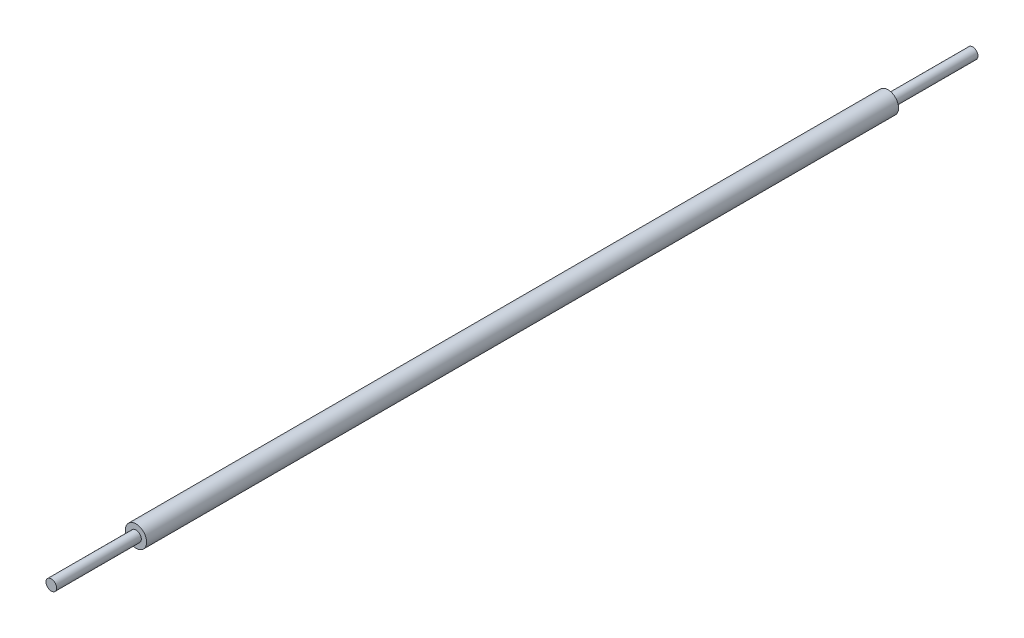
ISO-10303-21;
HEADER;
FILE_DESCRIPTION(('STEP AP214'),'2;1');
FILE_NAME('part.step','',(''),(''),'','','');
FILE_SCHEMA(('AUTOMOTIVE_DESIGN { 1 0 10303 214 1 1 1 1 }'));
ENDSEC;
DATA;
#1=APPLICATION_CONTEXT('core data for automotive mechanical design processes');
#2=APPLICATION_PROTOCOL_DEFINITION('international standard','automotive_design',2000,#1);
#3=PRODUCT_CONTEXT('',#1,'mechanical');
#4=PRODUCT('Part','Part','',(#3));
#5=PRODUCT_RELATED_PRODUCT_CATEGORY('part','',(#4));
#6=PRODUCT_DEFINITION_FORMATION('','',#4);
#7=PRODUCT_DEFINITION_CONTEXT('part definition',#1,'design');
#8=PRODUCT_DEFINITION('design','',#6,#7);
#9=PRODUCT_DEFINITION_SHAPE('','',#8);
#10=(LENGTH_UNIT() NAMED_UNIT(*) SI_UNIT(.MILLI.,.METRE.));
#11=(NAMED_UNIT(*) PLANE_ANGLE_UNIT() SI_UNIT($,.RADIAN.));
#12=(NAMED_UNIT(*) SI_UNIT($,.STERADIAN.) SOLID_ANGLE_UNIT());
#13=UNCERTAINTY_MEASURE_WITH_UNIT(LENGTH_MEASURE(1.E-05),#10,'distance_accuracy_value','');
#14=(GEOMETRIC_REPRESENTATION_CONTEXT(3) GLOBAL_UNCERTAINTY_ASSIGNED_CONTEXT((#13)) GLOBAL_UNIT_ASSIGNED_CONTEXT((#10,
#11,#12)) REPRESENTATION_CONTEXT('',''));
#15=CARTESIAN_POINT('',(0.,0.,0.));
#16=DIRECTION('',(0.,0.,1.));
#17=DIRECTION('',(1.,0.,0.));
#18=AXIS2_PLACEMENT_3D('',#15,#16,#17);
#19=CARTESIAN_POINT('',(0.,0.,177.5));
#20=DIRECTION('',(0.,0.,-1.));
#21=DIRECTION('',(-1.,0.,0.));
#22=AXIS2_PLACEMENT_3D('',#19,#20,#21);
#23=CYLINDRICAL_SURFACE('',#22,2.5);
#24=CARTESIAN_POINT('',(0.,0.,177.5));
#25=DIRECTION('',(0.,0.,1.));
#26=DIRECTION('',(1.,0.,0.));
#27=AXIS2_PLACEMENT_3D('',#24,#25,#26);
#28=CIRCLE('',#27,2.5);
#29=CARTESIAN_POINT('',(2.5,0.,177.5));
#30=VERTEX_POINT('',#29);
#31=EDGE_CURVE('E39',#30,#30,#28,.T.);
#32=ORIENTED_EDGE('',*,*,#31,.F.);
#33=EDGE_LOOP('',(#32));
#34=FACE_BOUND('',#33,.T.);
#35=CARTESIAN_POINT('',(0.,0.,0.));
#36=DIRECTION('',(0.,0.,1.));
#37=DIRECTION('',(1.,0.,0.));
#38=AXIS2_PLACEMENT_3D('',#35,#36,#37);
#39=CIRCLE('',#38,2.5);
#40=CARTESIAN_POINT('',(2.5,0.,0.));
#41=VERTEX_POINT('',#40);
#42=EDGE_CURVE('E43',#41,#41,#39,.T.);
#43=ORIENTED_EDGE('',*,*,#42,.T.);
#44=EDGE_LOOP('',(#43));
#45=FACE_BOUND('',#44,.T.);
#46=ADVANCED_FACE('F33',(#34,#45),#23,.T.);
#47=CARTESIAN_POINT('',(0.,0.,177.5));
#48=DIRECTION('',(0.,0.,1.));
#49=DIRECTION('',(1.,0.,0.));
#50=AXIS2_PLACEMENT_3D('',#47,#48,#49);
#51=PLANE('',#50);
#52=CARTESIAN_POINT('',(0.,0.,177.5));
#53=DIRECTION('',(0.,0.,1.));
#54=DIRECTION('',(1.,0.,0.));
#55=AXIS2_PLACEMENT_3D('',#52,#53,#54);
#56=CIRCLE('',#55,1.25);
#57=CARTESIAN_POINT('',(1.25,0.,177.5));
#58=VERTEX_POINT('',#57);
#59=EDGE_CURVE('E50',#58,#58,#56,.T.);
#60=ORIENTED_EDGE('',*,*,#59,.F.);
#61=EDGE_LOOP('',(#60));
#62=FACE_BOUND('',#61,.T.);
#63=ORIENTED_EDGE('',*,*,#31,.T.);
#64=EDGE_LOOP('',(#63));
#65=FACE_BOUND('',#64,.T.);
#66=ADVANCED_FACE('F74',(#62,#65),#51,.T.);
#67=CARTESIAN_POINT('',(0.,0.,0.));
#68=DIRECTION('',(0.,0.,1.));
#69=DIRECTION('',(1.,0.,0.));
#70=AXIS2_PLACEMENT_3D('',#67,#68,#69);
#71=PLANE('',#70);
#72=CARTESIAN_POINT('',(0.,0.,0.));
#73=DIRECTION('',(0.,0.,1.));
#74=DIRECTION('',(1.,0.,0.));
#75=AXIS2_PLACEMENT_3D('',#72,#73,#74);
#76=CIRCLE('',#75,1.25);
#77=CARTESIAN_POINT('',(1.25,0.,0.));
#78=VERTEX_POINT('',#77);
#79=EDGE_CURVE('E10',#78,#78,#76,.F.);
#80=ORIENTED_EDGE('',*,*,#79,.F.);
#81=EDGE_LOOP('',(#80));
#82=FACE_BOUND('',#81,.T.);
#83=ORIENTED_EDGE('',*,*,#42,.F.);
#84=EDGE_LOOP('',(#83));
#85=FACE_BOUND('',#84,.T.);
#86=ADVANCED_FACE('F79',(#82,#85),#71,.F.);
#87=CARTESIAN_POINT('',(0.,0.,197.5));
#88=DIRECTION('',(0.,0.,-1.));
#89=DIRECTION('',(-1.,0.,0.));
#90=AXIS2_PLACEMENT_3D('',#87,#88,#89);
#91=CYLINDRICAL_SURFACE('',#90,1.25);
#92=CARTESIAN_POINT('',(0.,0.,197.5));
#93=DIRECTION('',(0.,0.,1.));
#94=DIRECTION('',(1.,0.,0.));
#95=AXIS2_PLACEMENT_3D('',#92,#93,#94);
#96=CIRCLE('',#95,1.25);
#97=CARTESIAN_POINT('',(1.25,0.,197.5));
#98=VERTEX_POINT('',#97);
#99=EDGE_CURVE('E48',#98,#98,#96,.T.);
#100=ORIENTED_EDGE('',*,*,#99,.F.);
#101=EDGE_LOOP('',(#100));
#102=FACE_BOUND('',#101,.T.);
#103=ORIENTED_EDGE('',*,*,#59,.T.);
#104=EDGE_LOOP('',(#103));
#105=FACE_BOUND('',#104,.T.);
#106=ADVANCED_FACE('F70',(#102,#105),#91,.T.);
#107=CARTESIAN_POINT('',(0.,0.,197.5));
#108=DIRECTION('',(0.,0.,1.));
#109=DIRECTION('',(1.,0.,0.));
#110=AXIS2_PLACEMENT_3D('',#107,#108,#109);
#111=PLANE('',#110);
#112=ORIENTED_EDGE('',*,*,#99,.T.);
#113=EDGE_LOOP('',(#112));
#114=FACE_BOUND('',#113,.T.);
#115=ADVANCED_FACE('F63',(#114),#111,.T.);
#116=CARTESIAN_POINT('',(0.,0.,-20.));
#117=DIRECTION('',(0.,0.,1.));
#118=DIRECTION('',(1.,0.,0.));
#119=AXIS2_PLACEMENT_3D('',#116,#117,#118);
#120=CYLINDRICAL_SURFACE('',#119,1.25);
#121=CARTESIAN_POINT('',(0.,0.,-20.));
#122=DIRECTION('',(0.,0.,-1.));
#123=DIRECTION('',(-1.,0.,0.));
#124=AXIS2_PLACEMENT_3D('',#121,#122,#123);
#125=CIRCLE('',#124,1.25);
#126=CARTESIAN_POINT('',(-1.25,0.,-20.));
#127=VERTEX_POINT('',#126);
#128=EDGE_CURVE('E53',#127,#127,#125,.T.);
#129=ORIENTED_EDGE('',*,*,#128,.F.);
#130=EDGE_LOOP('',(#129));
#131=FACE_BOUND('',#130,.T.);
#132=ORIENTED_EDGE('',*,*,#79,.T.);
#133=EDGE_LOOP('',(#132));
#134=FACE_BOUND('',#133,.T.);
#135=ADVANCED_FACE('F61',(#131,#134),#120,.T.);
#136=CARTESIAN_POINT('',(0.,0.,-20.));
#137=DIRECTION('',(0.,0.,-1.));
#138=DIRECTION('',(-1.,0.,0.));
#139=AXIS2_PLACEMENT_3D('',#136,#137,#138);
#140=PLANE('',#139);
#141=ORIENTED_EDGE('',*,*,#128,.T.);
#142=EDGE_LOOP('',(#141));
#143=FACE_BOUND('',#142,.T.);
#144=ADVANCED_FACE('F59',(#143),#140,.T.);
#145=CLOSED_SHELL('',(#46,#66,#86,#106,#115,#135,#144));
#146=MANIFOLD_SOLID_BREP('B2',#145);
#147=ADVANCED_BREP_SHAPE_REPRESENTATION('',(#18,#146),#14);
#148=SHAPE_DEFINITION_REPRESENTATION(#9,#147);
ENDSEC;
END-ISO-10303-21;
